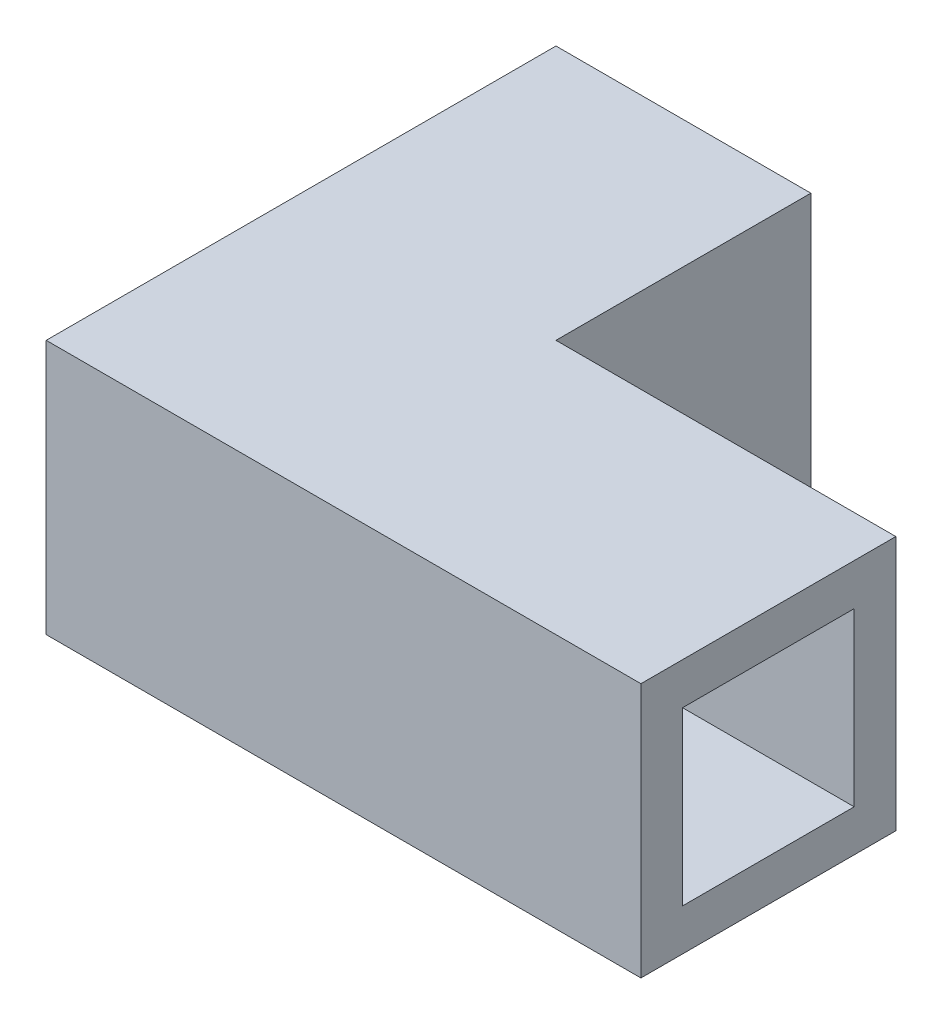
ISO-10303-21;
HEADER;
FILE_DESCRIPTION(('STEP AP214'),'2;1');
FILE_NAME('part.step','',(''),(''),'','','');
FILE_SCHEMA(('AUTOMOTIVE_DESIGN { 1 0 10303 214 1 1 1 1 }'));
ENDSEC;
DATA;
#1=APPLICATION_CONTEXT('core data for automotive mechanical design processes');
#2=APPLICATION_PROTOCOL_DEFINITION('international standard','automotive_design',2000,#1);
#3=PRODUCT_CONTEXT('',#1,'mechanical');
#4=PRODUCT('Part','Part','',(#3));
#5=PRODUCT_RELATED_PRODUCT_CATEGORY('part','',(#4));
#6=PRODUCT_DEFINITION_FORMATION('','',#4);
#7=PRODUCT_DEFINITION_CONTEXT('part definition',#1,'design');
#8=PRODUCT_DEFINITION('design','',#6,#7);
#9=PRODUCT_DEFINITION_SHAPE('','',#8);
#10=(LENGTH_UNIT() NAMED_UNIT(*) SI_UNIT(.MILLI.,.METRE.));
#11=(NAMED_UNIT(*) PLANE_ANGLE_UNIT() SI_UNIT($,.RADIAN.));
#12=(NAMED_UNIT(*) SI_UNIT($,.STERADIAN.) SOLID_ANGLE_UNIT());
#13=UNCERTAINTY_MEASURE_WITH_UNIT(LENGTH_MEASURE(1.E-05),#10,'distance_accuracy_value','');
#14=(GEOMETRIC_REPRESENTATION_CONTEXT(3) GLOBAL_UNCERTAINTY_ASSIGNED_CONTEXT((#13)) GLOBAL_UNIT_ASSIGNED_CONTEXT((#10,
#11,#12)) REPRESENTATION_CONTEXT('',''));
#15=CARTESIAN_POINT('',(0.,0.,0.));
#16=DIRECTION('',(0.,0.,1.));
#17=DIRECTION('',(1.,0.,0.));
#18=AXIS2_PLACEMENT_3D('',#15,#16,#17);
#19=CARTESIAN_POINT('',(0.,15.,-30.));
#20=DIRECTION('',(0.,0.,1.));
#21=DIRECTION('',(1.,0.,0.));
#22=AXIS2_PLACEMENT_3D('',#19,#20,#21);
#23=PLANE('',#22);
#24=DIRECTION('',(1.,0.,0.));
#25=VECTOR('',#24,1.);
#26=CARTESIAN_POINT('',(-2.44999999999999,12.55,-30.));
#27=LINE('',#26,#25);
#28=CARTESIAN_POINT('',(-12.55,12.55,-30.));
#29=VERTEX_POINT('',#28);
#30=CARTESIAN_POINT('',(-2.44999999999999,12.55,-30.));
#31=VERTEX_POINT('',#30);
#32=EDGE_CURVE('E224',#29,#31,#27,.T.);
#33=ORIENTED_EDGE('',*,*,#32,.F.);
#34=DIRECTION('',(0.,1.,0.));
#35=VECTOR('',#34,1.);
#36=CARTESIAN_POINT('',(-12.55,12.55,-30.));
#37=LINE('',#36,#35);
#38=CARTESIAN_POINT('',(-12.55,2.45,-30.));
#39=VERTEX_POINT('',#38);
#40=EDGE_CURVE('E207',#39,#29,#37,.T.);
#41=ORIENTED_EDGE('',*,*,#40,.F.);
#42=DIRECTION('',(-1.,0.,0.));
#43=VECTOR('',#42,1.);
#44=CARTESIAN_POINT('',(-2.44999999999999,2.45,-30.));
#45=LINE('',#44,#43);
#46=CARTESIAN_POINT('',(-2.44999999999999,2.45,-30.));
#47=VERTEX_POINT('',#46);
#48=EDGE_CURVE('E213',#47,#39,#45,.T.);
#49=ORIENTED_EDGE('',*,*,#48,.F.);
#50=DIRECTION('',(0.,-1.,0.));
#51=VECTOR('',#50,1.);
#52=CARTESIAN_POINT('',(-2.44999999999999,12.55,-30.));
#53=LINE('',#52,#51);
#54=EDGE_CURVE('E227',#31,#47,#53,.T.);
#55=ORIENTED_EDGE('',*,*,#54,.F.);
#56=EDGE_LOOP('',(#33,#41,#49,#55));
#57=FACE_BOUND('',#56,.T.);
#58=DIRECTION('',(-1.,0.,0.));
#59=VECTOR('',#58,1.);
#60=CARTESIAN_POINT('',(0.,0.,-30.));
#61=LINE('',#60,#59);
#62=CARTESIAN_POINT('',(0.,0.,-30.));
#63=VERTEX_POINT('',#62);
#64=CARTESIAN_POINT('',(-15.,0.,-30.));
#65=VERTEX_POINT('',#64);
#66=EDGE_CURVE('E266',#63,#65,#61,.T.);
#67=ORIENTED_EDGE('',*,*,#66,.T.);
#68=DIRECTION('',(0.,-1.,0.));
#69=VECTOR('',#68,1.);
#70=CARTESIAN_POINT('',(-15.,15.,-30.));
#71=LINE('',#70,#69);
#72=CARTESIAN_POINT('',(-15.,15.,-30.));
#73=VERTEX_POINT('',#72);
#74=EDGE_CURVE('E314',#73,#65,#71,.T.);
#75=ORIENTED_EDGE('',*,*,#74,.F.);
#76=DIRECTION('',(-1.,0.,0.));
#77=VECTOR('',#76,1.);
#78=CARTESIAN_POINT('',(0.,15.,-30.));
#79=LINE('',#78,#77);
#80=CARTESIAN_POINT('',(0.,15.,-30.));
#81=VERTEX_POINT('',#80);
#82=EDGE_CURVE('E273',#81,#73,#79,.T.);
#83=ORIENTED_EDGE('',*,*,#82,.F.);
#84=DIRECTION('',(0.,-1.,0.));
#85=VECTOR('',#84,1.);
#86=CARTESIAN_POINT('',(0.,15.,-30.));
#87=LINE('',#86,#85);
#88=EDGE_CURVE('E287',#81,#63,#87,.T.);
#89=ORIENTED_EDGE('',*,*,#88,.T.);
#90=EDGE_LOOP('',(#67,#75,#83,#89));
#91=FACE_BOUND('',#90,.T.);
#92=ADVANCED_FACE('F35',(#57,#91),#23,.F.);
#93=CARTESIAN_POINT('',(-15.,15.,-30.));
#94=DIRECTION('',(1.,0.,0.));
#95=DIRECTION('',(0.,0.,-1.));
#96=AXIS2_PLACEMENT_3D('',#93,#94,#95);
#97=PLANE('',#96);
#98=DIRECTION('',(0.,0.,1.));
#99=VECTOR('',#98,1.);
#100=CARTESIAN_POINT('',(-15.,0.,-30.));
#101=LINE('',#100,#99);
#102=CARTESIAN_POINT('',(-15.,0.,0.));
#103=VERTEX_POINT('',#102);
#104=EDGE_CURVE('E290',#65,#103,#101,.T.);
#105=ORIENTED_EDGE('',*,*,#104,.T.);
#106=DIRECTION('',(0.,-1.,0.));
#107=VECTOR('',#106,1.);
#108=CARTESIAN_POINT('',(-15.,15.,0.));
#109=LINE('',#108,#107);
#110=CARTESIAN_POINT('',(-15.,15.,0.));
#111=VERTEX_POINT('',#110);
#112=EDGE_CURVE('E311',#111,#103,#109,.T.);
#113=ORIENTED_EDGE('',*,*,#112,.F.);
#114=DIRECTION('',(0.,0.,1.));
#115=VECTOR('',#114,1.);
#116=CARTESIAN_POINT('',(-15.,15.,-30.));
#117=LINE('',#116,#115);
#118=EDGE_CURVE('E276',#73,#111,#117,.T.);
#119=ORIENTED_EDGE('',*,*,#118,.F.);
#120=ORIENTED_EDGE('',*,*,#74,.T.);
#121=EDGE_LOOP('',(#105,#113,#119,#120));
#122=FACE_BOUND('',#121,.T.);
#123=ADVANCED_FACE('F347',(#122),#97,.F.);
#124=CARTESIAN_POINT('',(0.,15.,0.));
#125=DIRECTION('',(0.,0.,-1.));
#126=DIRECTION('',(-1.,0.,0.));
#127=AXIS2_PLACEMENT_3D('',#124,#125,#126);
#128=PLANE('',#127);
#129=DIRECTION('',(1.,0.,0.));
#130=VECTOR('',#129,1.);
#131=CARTESIAN_POINT('',(0.,0.,0.));
#132=LINE('',#131,#130);
#133=CARTESIAN_POINT('',(20.,0.,0.));
#134=VERTEX_POINT('',#133);
#135=EDGE_CURVE('E293',#103,#134,#132,.T.);
#136=ORIENTED_EDGE('',*,*,#135,.T.);
#137=DIRECTION('',(0.,-1.,0.));
#138=VECTOR('',#137,1.);
#139=CARTESIAN_POINT('',(20.,15.,0.));
#140=LINE('',#139,#138);
#141=CARTESIAN_POINT('',(20.,15.,0.));
#142=VERTEX_POINT('',#141);
#143=EDGE_CURVE('E308',#142,#134,#140,.T.);
#144=ORIENTED_EDGE('',*,*,#143,.F.);
#145=DIRECTION('',(1.,0.,0.));
#146=VECTOR('',#145,1.);
#147=CARTESIAN_POINT('',(-15.,15.,0.));
#148=LINE('',#147,#146);
#149=EDGE_CURVE('E279',#111,#142,#148,.T.);
#150=ORIENTED_EDGE('',*,*,#149,.F.);
#151=ORIENTED_EDGE('',*,*,#112,.T.);
#152=EDGE_LOOP('',(#136,#144,#150,#151));
#153=FACE_BOUND('',#152,.T.);
#154=ADVANCED_FACE('F353',(#153),#128,.F.);
#155=CARTESIAN_POINT('',(20.,15.,0.));
#156=DIRECTION('',(-1.,0.,0.));
#157=DIRECTION('',(0.,0.,1.));
#158=AXIS2_PLACEMENT_3D('',#155,#156,#157);
#159=PLANE('',#158);
#160=DIRECTION('',(0.,0.,1.));
#161=VECTOR('',#160,1.);
#162=CARTESIAN_POINT('',(20.,12.55,-2.44999999999999));
#163=LINE('',#162,#161);
#164=CARTESIAN_POINT('',(20.,12.55,-12.55));
#165=VERTEX_POINT('',#164);
#166=CARTESIAN_POINT('',(20.,12.55,-2.44999999999999));
#167=VERTEX_POINT('',#166);
#168=EDGE_CURVE('E256',#165,#167,#163,.T.);
#169=ORIENTED_EDGE('',*,*,#168,.F.);
#170=DIRECTION('',(0.,1.,0.));
#171=VECTOR('',#170,1.);
#172=CARTESIAN_POINT('',(20.,2.45,-12.55));
#173=LINE('',#172,#171);
#174=CARTESIAN_POINT('',(20.,2.45,-12.55));
#175=VERTEX_POINT('',#174);
#176=EDGE_CURVE('E234',#175,#165,#173,.T.);
#177=ORIENTED_EDGE('',*,*,#176,.F.);
#178=DIRECTION('',(0.,0.,-1.));
#179=VECTOR('',#178,1.);
#180=CARTESIAN_POINT('',(20.,2.45,-2.44999999999999));
#181=LINE('',#180,#179);
#182=CARTESIAN_POINT('',(20.,2.45,-2.44999999999999));
#183=VERTEX_POINT('',#182);
#184=EDGE_CURVE('E245',#183,#175,#181,.T.);
#185=ORIENTED_EDGE('',*,*,#184,.F.);
#186=DIRECTION('',(0.,-1.,0.));
#187=VECTOR('',#186,1.);
#188=CARTESIAN_POINT('',(20.,2.45,-2.44999999999999));
#189=LINE('',#188,#187);
#190=EDGE_CURVE('E259',#167,#183,#189,.T.);
#191=ORIENTED_EDGE('',*,*,#190,.F.);
#192=EDGE_LOOP('',(#169,#177,#185,#191));
#193=FACE_BOUND('',#192,.T.);
#194=DIRECTION('',(0.,0.,-1.));
#195=VECTOR('',#194,1.);
#196=CARTESIAN_POINT('',(20.,0.,0.));
#197=LINE('',#196,#195);
#198=CARTESIAN_POINT('',(20.,0.,-15.));
#199=VERTEX_POINT('',#198);
#200=EDGE_CURVE('E295',#134,#199,#197,.T.);
#201=ORIENTED_EDGE('',*,*,#200,.T.);
#202=DIRECTION('',(0.,-1.,0.));
#203=VECTOR('',#202,1.);
#204=CARTESIAN_POINT('',(20.,15.,-15.));
#205=LINE('',#204,#203);
#206=CARTESIAN_POINT('',(20.,15.,-15.));
#207=VERTEX_POINT('',#206);
#208=EDGE_CURVE('E305',#207,#199,#205,.T.);
#209=ORIENTED_EDGE('',*,*,#208,.F.);
#210=DIRECTION('',(0.,0.,-1.));
#211=VECTOR('',#210,1.);
#212=CARTESIAN_POINT('',(20.,15.,0.));
#213=LINE('',#212,#211);
#214=EDGE_CURVE('E281',#142,#207,#213,.T.);
#215=ORIENTED_EDGE('',*,*,#214,.F.);
#216=ORIENTED_EDGE('',*,*,#143,.T.);
#217=EDGE_LOOP('',(#201,#209,#215,#216));
#218=FACE_BOUND('',#217,.T.);
#219=ADVANCED_FACE('F361',(#193,#218),#159,.F.);
#220=CARTESIAN_POINT('',(20.,15.,-15.));
#221=DIRECTION('',(0.,0.,1.));
#222=DIRECTION('',(1.,0.,0.));
#223=AXIS2_PLACEMENT_3D('',#220,#221,#222);
#224=PLANE('',#223);
#225=DIRECTION('',(-1.,0.,0.));
#226=VECTOR('',#225,1.);
#227=CARTESIAN_POINT('',(20.,0.,-15.));
#228=LINE('',#227,#226);
#229=CARTESIAN_POINT('',(0.,0.,-15.));
#230=VERTEX_POINT('',#229);
#231=EDGE_CURVE('E297',#199,#230,#228,.T.);
#232=ORIENTED_EDGE('',*,*,#231,.T.);
#233=DIRECTION('',(0.,-1.,0.));
#234=VECTOR('',#233,1.);
#235=CARTESIAN_POINT('',(0.,15.,-15.));
#236=LINE('',#235,#234);
#237=CARTESIAN_POINT('',(0.,15.,-15.));
#238=VERTEX_POINT('',#237);
#239=EDGE_CURVE('E302',#238,#230,#236,.T.);
#240=ORIENTED_EDGE('',*,*,#239,.F.);
#241=DIRECTION('',(-1.,0.,0.));
#242=VECTOR('',#241,1.);
#243=CARTESIAN_POINT('',(20.,15.,-15.));
#244=LINE('',#243,#242);
#245=EDGE_CURVE('E283',#207,#238,#244,.T.);
#246=ORIENTED_EDGE('',*,*,#245,.F.);
#247=ORIENTED_EDGE('',*,*,#208,.T.);
#248=EDGE_LOOP('',(#232,#240,#246,#247));
#249=FACE_BOUND('',#248,.T.);
#250=ADVANCED_FACE('F365',(#249),#224,.F.);
#251=CARTESIAN_POINT('',(0.,15.,-15.));
#252=DIRECTION('',(-1.,0.,0.));
#253=DIRECTION('',(0.,0.,1.));
#254=AXIS2_PLACEMENT_3D('',#251,#252,#253);
#255=PLANE('',#254);
#256=DIRECTION('',(0.,0.,-1.));
#257=VECTOR('',#256,1.);
#258=CARTESIAN_POINT('',(0.,0.,-15.));
#259=LINE('',#258,#257);
#260=EDGE_CURVE('E277',#230,#63,#259,.T.);
#261=ORIENTED_EDGE('',*,*,#260,.T.);
#262=ORIENTED_EDGE('',*,*,#88,.F.);
#263=DIRECTION('',(0.,0.,-1.));
#264=VECTOR('',#263,1.);
#265=CARTESIAN_POINT('',(0.,15.,-15.));
#266=LINE('',#265,#264);
#267=EDGE_CURVE('E285',#238,#81,#266,.T.);
#268=ORIENTED_EDGE('',*,*,#267,.F.);
#269=ORIENTED_EDGE('',*,*,#239,.T.);
#270=EDGE_LOOP('',(#261,#262,#268,#269));
#271=FACE_BOUND('',#270,.T.);
#272=ADVANCED_FACE('F369',(#271),#255,.F.);
#273=CARTESIAN_POINT('',(0.,15.,0.));
#274=DIRECTION('',(0.,1.,0.));
#275=DIRECTION('',(0.,0.,1.));
#276=AXIS2_PLACEMENT_3D('',#273,#274,#275);
#277=PLANE('',#276);
#278=ORIENTED_EDGE('',*,*,#82,.T.);
#279=ORIENTED_EDGE('',*,*,#118,.T.);
#280=ORIENTED_EDGE('',*,*,#149,.T.);
#281=ORIENTED_EDGE('',*,*,#214,.T.);
#282=ORIENTED_EDGE('',*,*,#245,.T.);
#283=ORIENTED_EDGE('',*,*,#267,.T.);
#284=EDGE_LOOP('',(#278,#279,#280,#281,#282,#283));
#285=FACE_BOUND('',#284,.T.);
#286=ADVANCED_FACE('F373',(#285),#277,.T.);
#287=CARTESIAN_POINT('',(0.,0.,0.));
#288=DIRECTION('',(0.,1.,0.));
#289=DIRECTION('',(0.,0.,1.));
#290=AXIS2_PLACEMENT_3D('',#287,#288,#289);
#291=PLANE('',#290);
#292=ORIENTED_EDGE('',*,*,#66,.F.);
#293=ORIENTED_EDGE('',*,*,#260,.F.);
#294=ORIENTED_EDGE('',*,*,#231,.F.);
#295=ORIENTED_EDGE('',*,*,#200,.F.);
#296=ORIENTED_EDGE('',*,*,#135,.F.);
#297=ORIENTED_EDGE('',*,*,#104,.F.);
#298=EDGE_LOOP('',(#292,#293,#294,#295,#296,#297));
#299=FACE_BOUND('',#298,.T.);
#300=ADVANCED_FACE('F375',(#299),#291,.F.);
#301=CARTESIAN_POINT('',(0.,2.45,-12.55));
#302=DIRECTION('',(0.,0.,-1.));
#303=DIRECTION('',(-1.,0.,0.));
#304=AXIS2_PLACEMENT_3D('',#301,#302,#303);
#305=PLANE('',#304);
#306=ORIENTED_EDGE('',*,*,#176,.T.);
#307=DIRECTION('',(1.,0.,0.));
#308=VECTOR('',#307,1.);
#309=CARTESIAN_POINT('',(0.,12.55,-12.55));
#310=LINE('',#309,#308);
#311=CARTESIAN_POINT('',(0.,12.55,-12.55));
#312=VERTEX_POINT('',#311);
#313=EDGE_CURVE('E254',#312,#165,#310,.T.);
#314=ORIENTED_EDGE('',*,*,#313,.F.);
#315=DIRECTION('',(0.,1.,0.));
#316=VECTOR('',#315,1.);
#317=CARTESIAN_POINT('',(0.,2.45,-12.55));
#318=LINE('',#317,#316);
#319=CARTESIAN_POINT('',(0.,2.45,-12.55));
#320=VERTEX_POINT('',#319);
#321=EDGE_CURVE('E241',#320,#312,#318,.T.);
#322=ORIENTED_EDGE('',*,*,#321,.F.);
#323=DIRECTION('',(1.,0.,0.));
#324=VECTOR('',#323,1.);
#325=CARTESIAN_POINT('',(0.,2.45,-12.55));
#326=LINE('',#325,#324);
#327=EDGE_CURVE('E264',#320,#175,#326,.T.);
#328=ORIENTED_EDGE('',*,*,#327,.T.);
#329=EDGE_LOOP('',(#306,#314,#322,#328));
#330=FACE_BOUND('',#329,.T.);
#331=ADVANCED_FACE('F378',(#330),#305,.F.);
#332=CARTESIAN_POINT('',(0.,2.45,-2.45));
#333=DIRECTION('',(0.,-1.,0.));
#334=DIRECTION('',(0.,0.,-1.));
#335=AXIS2_PLACEMENT_3D('',#332,#333,#334);
#336=PLANE('',#335);
#337=ORIENTED_EDGE('',*,*,#184,.T.);
#338=ORIENTED_EDGE('',*,*,#327,.F.);
#339=DIRECTION('',(0.,0.,-1.));
#340=VECTOR('',#339,1.);
#341=CARTESIAN_POINT('',(0.,2.45,-2.45));
#342=LINE('',#341,#340);
#343=CARTESIAN_POINT('',(0.,2.45,-2.45));
#344=VERTEX_POINT('',#343);
#345=EDGE_CURVE('E251',#344,#320,#342,.T.);
#346=ORIENTED_EDGE('',*,*,#345,.F.);
#347=DIRECTION('',(1.,0.,0.));
#348=VECTOR('',#347,1.);
#349=CARTESIAN_POINT('',(0.,2.45,-2.45));
#350=LINE('',#349,#348);
#351=EDGE_CURVE('E267',#344,#183,#350,.T.);
#352=ORIENTED_EDGE('',*,*,#351,.T.);
#353=EDGE_LOOP('',(#337,#338,#346,#352));
#354=FACE_BOUND('',#353,.T.);
#355=ADVANCED_FACE('F385',(#354),#336,.F.);
#356=CARTESIAN_POINT('',(0.,2.45,-2.45));
#357=DIRECTION('',(0.,0.,1.));
#358=DIRECTION('',(1.,0.,0.));
#359=AXIS2_PLACEMENT_3D('',#356,#357,#358);
#360=PLANE('',#359);
#361=ORIENTED_EDGE('',*,*,#190,.T.);
#362=ORIENTED_EDGE('',*,*,#351,.F.);
#363=DIRECTION('',(0.,-1.,0.));
#364=VECTOR('',#363,1.);
#365=CARTESIAN_POINT('',(0.,2.45,-2.45));
#366=LINE('',#365,#364);
#367=CARTESIAN_POINT('',(0.,12.55,-2.45));
#368=VERTEX_POINT('',#367);
#369=EDGE_CURVE('E248',#368,#344,#366,.T.);
#370=ORIENTED_EDGE('',*,*,#369,.F.);
#371=DIRECTION('',(1.,0.,0.));
#372=VECTOR('',#371,1.);
#373=CARTESIAN_POINT('',(0.,12.55,-2.45));
#374=LINE('',#373,#372);
#375=EDGE_CURVE('E269',#368,#167,#374,.T.);
#376=ORIENTED_EDGE('',*,*,#375,.T.);
#377=EDGE_LOOP('',(#361,#362,#370,#376));
#378=FACE_BOUND('',#377,.T.);
#379=ADVANCED_FACE('F390',(#378),#360,.F.);
#380=CARTESIAN_POINT('',(0.,12.55,-2.45));
#381=DIRECTION('',(0.,1.,0.));
#382=DIRECTION('',(0.,0.,1.));
#383=AXIS2_PLACEMENT_3D('',#380,#381,#382);
#384=PLANE('',#383);
#385=ORIENTED_EDGE('',*,*,#168,.T.);
#386=ORIENTED_EDGE('',*,*,#375,.F.);
#387=DIRECTION('',(0.,0.,1.));
#388=VECTOR('',#387,1.);
#389=CARTESIAN_POINT('',(0.,12.55,-2.45));
#390=LINE('',#389,#388);
#391=EDGE_CURVE('E244',#312,#368,#390,.T.);
#392=ORIENTED_EDGE('',*,*,#391,.F.);
#393=ORIENTED_EDGE('',*,*,#313,.T.);
#394=EDGE_LOOP('',(#385,#386,#392,#393));
#395=FACE_BOUND('',#394,.T.);
#396=ADVANCED_FACE('F387',(#395),#384,.F.);
#397=CARTESIAN_POINT('',(0.,0.,0.));
#398=DIRECTION('',(-1.,0.,0.));
#399=DIRECTION('',(0.,0.,1.));
#400=AXIS2_PLACEMENT_3D('',#397,#398,#399);
#401=PLANE('',#400);
#402=DIRECTION('',(0.,0.,1.));
#403=VECTOR('',#402,1.);
#404=CARTESIAN_POINT('',(0.,11.5,-11.5));
#405=LINE('',#404,#403);
#406=CARTESIAN_POINT('',(0.,11.5,-11.5005000750175));
#407=VERTEX_POINT('',#406);
#408=CARTESIAN_POINT('',(0.,11.5,-3.5));
#409=VERTEX_POINT('',#408);
#410=EDGE_CURVE('E188',#407,#409,#405,.T.);
#411=ORIENTED_EDGE('',*,*,#410,.F.);
#412=DIRECTION('',(0.,1.,0.));
#413=VECTOR('',#412,1.);
#414=CARTESIAN_POINT('',(0.,7.5,-11.5005000750175));
#415=LINE('',#414,#413);
#416=CARTESIAN_POINT('',(0.,3.5,-11.5005000750175));
#417=VERTEX_POINT('',#416);
#418=EDGE_CURVE('E186',#407,#417,#415,.F.);
#419=ORIENTED_EDGE('',*,*,#418,.T.);
#420=DIRECTION('',(0.,0.,-1.));
#421=VECTOR('',#420,1.);
#422=CARTESIAN_POINT('',(0.,3.5,-11.5));
#423=LINE('',#422,#421);
#424=CARTESIAN_POINT('',(0.,3.5,-3.5));
#425=VERTEX_POINT('',#424);
#426=EDGE_CURVE('E172',#425,#417,#423,.T.);
#427=ORIENTED_EDGE('',*,*,#426,.F.);
#428=DIRECTION('',(0.,-1.,0.));
#429=VECTOR('',#428,1.);
#430=CARTESIAN_POINT('',(0.,11.5,-3.5));
#431=LINE('',#430,#429);
#432=EDGE_CURVE('E178',#409,#425,#431,.T.);
#433=ORIENTED_EDGE('',*,*,#432,.F.);
#434=EDGE_LOOP('',(#411,#419,#427,#433));
#435=FACE_BOUND('',#434,.T.);
#436=ORIENTED_EDGE('',*,*,#321,.T.);
#437=ORIENTED_EDGE('',*,*,#391,.T.);
#438=ORIENTED_EDGE('',*,*,#369,.T.);
#439=ORIENTED_EDGE('',*,*,#345,.T.);
#440=EDGE_LOOP('',(#436,#437,#438,#439));
#441=FACE_BOUND('',#440,.T.);
#442=ADVANCED_FACE('F183',(#435,#441),#401,.F.);
#443=CARTESIAN_POINT('',(-12.55,12.55,-13.));
#444=DIRECTION('',(-1.,0.,0.));
#445=DIRECTION('',(0.,0.,1.));
#446=AXIS2_PLACEMENT_3D('',#443,#444,#445);
#447=PLANE('',#446);
#448=ORIENTED_EDGE('',*,*,#40,.T.);
#449=DIRECTION('',(0.,0.,-1.));
#450=VECTOR('',#449,1.);
#451=CARTESIAN_POINT('',(-12.55,12.55,-13.));
#452=LINE('',#451,#450);
#453=CARTESIAN_POINT('',(-12.55,12.55,-13.));
#454=VERTEX_POINT('',#453);
#455=EDGE_CURVE('E222',#454,#29,#452,.T.);
#456=ORIENTED_EDGE('',*,*,#455,.F.);
#457=DIRECTION('',(0.,1.,0.));
#458=VECTOR('',#457,1.);
#459=CARTESIAN_POINT('',(-12.55,12.55,-13.));
#460=LINE('',#459,#458);
#461=CARTESIAN_POINT('',(-12.55,2.45,-13.));
#462=VERTEX_POINT('',#461);
#463=EDGE_CURVE('E209',#462,#454,#460,.T.);
#464=ORIENTED_EDGE('',*,*,#463,.F.);
#465=DIRECTION('',(0.,0.,-1.));
#466=VECTOR('',#465,1.);
#467=CARTESIAN_POINT('',(-12.55,2.45,-13.));
#468=LINE('',#467,#466);
#469=EDGE_CURVE('E232',#462,#39,#468,.T.);
#470=ORIENTED_EDGE('',*,*,#469,.T.);
#471=EDGE_LOOP('',(#448,#456,#464,#470));
#472=FACE_BOUND('',#471,.T.);
#473=ADVANCED_FACE('F400',(#472),#447,.F.);
#474=CARTESIAN_POINT('',(-2.45,2.45,-13.));
#475=DIRECTION('',(0.,-1.,0.));
#476=DIRECTION('',(0.,0.,-1.));
#477=AXIS2_PLACEMENT_3D('',#474,#475,#476);
#478=PLANE('',#477);
#479=ORIENTED_EDGE('',*,*,#48,.T.);
#480=ORIENTED_EDGE('',*,*,#469,.F.);
#481=DIRECTION('',(-1.,0.,0.));
#482=VECTOR('',#481,1.);
#483=CARTESIAN_POINT('',(-2.45,2.45,-13.));
#484=LINE('',#483,#482);
#485=CARTESIAN_POINT('',(-2.45,2.45,-13.));
#486=VERTEX_POINT('',#485);
#487=EDGE_CURVE('E219',#486,#462,#484,.T.);
#488=ORIENTED_EDGE('',*,*,#487,.F.);
#489=DIRECTION('',(0.,0.,-1.));
#490=VECTOR('',#489,1.);
#491=CARTESIAN_POINT('',(-2.45,2.45,-13.));
#492=LINE('',#491,#490);
#493=EDGE_CURVE('E235',#486,#47,#492,.T.);
#494=ORIENTED_EDGE('',*,*,#493,.T.);
#495=EDGE_LOOP('',(#479,#480,#488,#494));
#496=FACE_BOUND('',#495,.T.);
#497=ADVANCED_FACE('F403',(#496),#478,.F.);
#498=CARTESIAN_POINT('',(-2.45,12.55,-13.));
#499=DIRECTION('',(1.,0.,0.));
#500=DIRECTION('',(0.,0.,-1.));
#501=AXIS2_PLACEMENT_3D('',#498,#499,#500);
#502=PLANE('',#501);
#503=ORIENTED_EDGE('',*,*,#54,.T.);
#504=ORIENTED_EDGE('',*,*,#493,.F.);
#505=DIRECTION('',(0.,-1.,0.));
#506=VECTOR('',#505,1.);
#507=CARTESIAN_POINT('',(-2.45,12.55,-13.));
#508=LINE('',#507,#506);
#509=CARTESIAN_POINT('',(-2.45,12.55,-13.));
#510=VERTEX_POINT('',#509);
#511=EDGE_CURVE('E216',#510,#486,#508,.T.);
#512=ORIENTED_EDGE('',*,*,#511,.F.);
#513=DIRECTION('',(0.,0.,-1.));
#514=VECTOR('',#513,1.);
#515=CARTESIAN_POINT('',(-2.45,12.55,-13.));
#516=LINE('',#515,#514);
#517=EDGE_CURVE('E237',#510,#31,#516,.T.);
#518=ORIENTED_EDGE('',*,*,#517,.T.);
#519=EDGE_LOOP('',(#503,#504,#512,#518));
#520=FACE_BOUND('',#519,.T.);
#521=ADVANCED_FACE('F408',(#520),#502,.F.);
#522=CARTESIAN_POINT('',(-2.45,12.55,-13.));
#523=DIRECTION('',(0.,1.,0.));
#524=DIRECTION('',(0.,0.,1.));
#525=AXIS2_PLACEMENT_3D('',#522,#523,#524);
#526=PLANE('',#525);
#527=ORIENTED_EDGE('',*,*,#32,.T.);
#528=ORIENTED_EDGE('',*,*,#517,.F.);
#529=DIRECTION('',(1.,0.,0.));
#530=VECTOR('',#529,1.);
#531=CARTESIAN_POINT('',(-2.45,12.55,-13.));
#532=LINE('',#531,#530);
#533=EDGE_CURVE('E212',#454,#510,#532,.T.);
#534=ORIENTED_EDGE('',*,*,#533,.F.);
#535=ORIENTED_EDGE('',*,*,#455,.T.);
#536=EDGE_LOOP('',(#527,#528,#534,#535));
#537=FACE_BOUND('',#536,.T.);
#538=ADVANCED_FACE('F405',(#537),#526,.F.);
#539=CARTESIAN_POINT('',(0.,0.,-13.));
#540=DIRECTION('',(0.,0.,-1.));
#541=DIRECTION('',(-1.,0.,0.));
#542=AXIS2_PLACEMENT_3D('',#539,#540,#541);
#543=PLANE('',#542);
#544=DIRECTION('',(0.,-1.,0.));
#545=VECTOR('',#544,1.);
#546=CARTESIAN_POINT('',(-3.5,11.5,-13.));
#547=LINE('',#546,#545);
#548=CARTESIAN_POINT('',(-3.5,11.5,-13.));
#549=VERTEX_POINT('',#548);
#550=CARTESIAN_POINT('',(-3.5,3.5,-13.));
#551=VERTEX_POINT('',#550);
#552=EDGE_CURVE('E174',#549,#551,#547,.T.);
#553=ORIENTED_EDGE('',*,*,#552,.F.);
#554=DIRECTION('',(1.,0.,0.));
#555=VECTOR('',#554,1.);
#556=CARTESIAN_POINT('',(-11.5,11.5,-13.));
#557=LINE('',#556,#555);
#558=CARTESIAN_POINT('',(-11.5,11.5,-13.));
#559=VERTEX_POINT('',#558);
#560=EDGE_CURVE('E201',#559,#549,#557,.T.);
#561=ORIENTED_EDGE('',*,*,#560,.F.);
#562=DIRECTION('',(0.,1.,0.));
#563=VECTOR('',#562,1.);
#564=CARTESIAN_POINT('',(-11.5,11.5,-13.));
#565=LINE('',#564,#563);
#566=CARTESIAN_POINT('',(-11.5,3.5,-13.));
#567=VERTEX_POINT('',#566);
#568=EDGE_CURVE('E198',#567,#559,#565,.T.);
#569=ORIENTED_EDGE('',*,*,#568,.F.);
#570=DIRECTION('',(-1.,0.,0.));
#571=VECTOR('',#570,1.);
#572=CARTESIAN_POINT('',(-11.5,3.5,-13.));
#573=LINE('',#572,#571);
#574=EDGE_CURVE('E195',#551,#567,#573,.T.);
#575=ORIENTED_EDGE('',*,*,#574,.F.);
#576=EDGE_LOOP('',(#553,#561,#569,#575));
#577=FACE_BOUND('',#576,.T.);
#578=ORIENTED_EDGE('',*,*,#463,.T.);
#579=ORIENTED_EDGE('',*,*,#533,.T.);
#580=ORIENTED_EDGE('',*,*,#511,.T.);
#581=ORIENTED_EDGE('',*,*,#487,.T.);
#582=EDGE_LOOP('',(#578,#579,#580,#581));
#583=FACE_BOUND('',#582,.T.);
#584=ADVANCED_FACE('F334',(#577,#583),#543,.T.);
#585=CARTESIAN_POINT('',(-11.5,11.5,-9.));
#586=DIRECTION('',(0.,1.,0.));
#587=DIRECTION('',(0.,0.,1.));
#588=AXIS2_PLACEMENT_3D('',#585,#586,#587);
#589=PLANE('',#588);
#590=DIRECTION('',(1.,0.,0.));
#591=VECTOR('',#590,1.);
#592=CARTESIAN_POINT('',(-22.8137084989848,11.5,-3.50000000000002));
#593=LINE('',#592,#591);
#594=CARTESIAN_POINT('',(-6.5,11.5,-3.5));
#595=VERTEX_POINT('',#594);
#596=EDGE_CURVE('E175',#595,#409,#593,.T.);
#597=ORIENTED_EDGE('',*,*,#596,.F.);
#598=CARTESIAN_POINT('',(-6.5,11.5,-8.5));
#599=DIRECTION('',(0.,1.,0.));
#600=DIRECTION('',(0.,0.,1.));
#601=AXIS2_PLACEMENT_3D('',#598,#599,#600);
#602=CIRCLE('',#601,5.);
#603=CARTESIAN_POINT('',(-11.5,11.5,-8.50000000000001));
#604=VERTEX_POINT('',#603);
#605=EDGE_CURVE('E323',#595,#604,#602,.F.);
#606=ORIENTED_EDGE('',*,*,#605,.T.);
#607=DIRECTION('',(0.,0.,-1.));
#608=VECTOR('',#607,1.);
#609=CARTESIAN_POINT('',(-11.5,11.5,-9.));
#610=LINE('',#609,#608);
#611=EDGE_CURVE('E205',#604,#559,#610,.T.);
#612=ORIENTED_EDGE('',*,*,#611,.T.);
#613=ORIENTED_EDGE('',*,*,#560,.T.);
#614=CARTESIAN_POINT('',(0.0707142142714248,11.5,-16.5));
#615=DIRECTION('',(0.,1.,0.));
#616=DIRECTION('',(0.,0.,1.));
#617=AXIS2_PLACEMENT_3D('',#614,#615,#616);
#618=CIRCLE('',#617,5.);
#619=EDGE_CURVE('E43',#549,#407,#618,.T.);
#620=ORIENTED_EDGE('',*,*,#619,.T.);
#621=ORIENTED_EDGE('',*,*,#410,.T.);
#622=EDGE_LOOP('',(#597,#606,#612,#613,#620,#621));
#623=FACE_BOUND('',#622,.T.);
#624=ADVANCED_FACE('F326',(#623),#589,.F.);
#625=CARTESIAN_POINT('',(-11.5,11.5,-9.));
#626=DIRECTION('',(-1.,0.,0.));
#627=DIRECTION('',(0.,0.,1.));
#628=AXIS2_PLACEMENT_3D('',#625,#626,#627);
#629=PLANE('',#628);
#630=ORIENTED_EDGE('',*,*,#611,.F.);
#631=DIRECTION('',(0.,-1.,0.));
#632=VECTOR('',#631,1.);
#633=CARTESIAN_POINT('',(-11.5,3.5,-8.50000000000001));
#634=LINE('',#633,#632);
#635=CARTESIAN_POINT('',(-11.5,3.5,-8.50000000000001));
#636=VERTEX_POINT('',#635);
#637=EDGE_CURVE('E318',#604,#636,#634,.T.);
#638=ORIENTED_EDGE('',*,*,#637,.T.);
#639=DIRECTION('',(0.,0.,-1.));
#640=VECTOR('',#639,1.);
#641=CARTESIAN_POINT('',(-11.5,3.5,-9.));
#642=LINE('',#641,#640);
#643=EDGE_CURVE('E204',#636,#567,#642,.T.);
#644=ORIENTED_EDGE('',*,*,#643,.T.);
#645=ORIENTED_EDGE('',*,*,#568,.T.);
#646=EDGE_LOOP('',(#630,#638,#644,#645));
#647=FACE_BOUND('',#646,.T.);
#648=ADVANCED_FACE('F338',(#647),#629,.F.);
#649=CARTESIAN_POINT('',(-11.5,3.5,-9.));
#650=DIRECTION('',(0.,-1.,0.));
#651=DIRECTION('',(0.,0.,-1.));
#652=AXIS2_PLACEMENT_3D('',#649,#650,#651);
#653=PLANE('',#652);
#654=ORIENTED_EDGE('',*,*,#643,.F.);
#655=CARTESIAN_POINT('',(-6.5,3.5,-8.5));
#656=DIRECTION('',(0.,-1.,0.));
#657=DIRECTION('',(0.,0.,-1.));
#658=AXIS2_PLACEMENT_3D('',#655,#656,#657);
#659=CIRCLE('',#658,5.);
#660=CARTESIAN_POINT('',(-6.5,3.5,-3.5));
#661=VERTEX_POINT('',#660);
#662=EDGE_CURVE('E58',#636,#661,#659,.F.);
#663=ORIENTED_EDGE('',*,*,#662,.T.);
#664=DIRECTION('',(1.,0.,0.));
#665=VECTOR('',#664,1.);
#666=CARTESIAN_POINT('',(-22.8137084989848,3.5,-3.50000000000002));
#667=LINE('',#666,#665);
#668=EDGE_CURVE('E168',#661,#425,#667,.T.);
#669=ORIENTED_EDGE('',*,*,#668,.T.);
#670=ORIENTED_EDGE('',*,*,#426,.T.);
#671=CARTESIAN_POINT('',(0.0707142142714248,3.5,-16.5));
#672=DIRECTION('',(0.,-1.,0.));
#673=DIRECTION('',(0.,0.,-1.));
#674=AXIS2_PLACEMENT_3D('',#671,#672,#673);
#675=CIRCLE('',#674,5.);
#676=EDGE_CURVE('E11',#417,#551,#675,.T.);
#677=ORIENTED_EDGE('',*,*,#676,.T.);
#678=ORIENTED_EDGE('',*,*,#574,.T.);
#679=EDGE_LOOP('',(#654,#663,#669,#670,#677,#678));
#680=FACE_BOUND('',#679,.T.);
#681=ADVANCED_FACE('F170',(#680),#653,.F.);
#682=CARTESIAN_POINT('',(-22.8137084989848,11.5,-3.50000000000002));
#683=DIRECTION('',(0.,0.,1.));
#684=DIRECTION('',(1.,0.,0.));
#685=AXIS2_PLACEMENT_3D('',#682,#683,#684);
#686=PLANE('',#685);
#687=ORIENTED_EDGE('',*,*,#668,.F.);
#688=DIRECTION('',(0.,-1.,0.));
#689=VECTOR('',#688,1.);
#690=CARTESIAN_POINT('',(-6.5,11.5,-3.5));
#691=LINE('',#690,#689);
#692=EDGE_CURVE('E50',#661,#595,#691,.F.);
#693=ORIENTED_EDGE('',*,*,#692,.T.);
#694=ORIENTED_EDGE('',*,*,#596,.T.);
#695=ORIENTED_EDGE('',*,*,#432,.T.);
#696=EDGE_LOOP('',(#687,#693,#694,#695));
#697=FACE_BOUND('',#696,.T.);
#698=ADVANCED_FACE('F179',(#697),#686,.F.);
#699=CARTESIAN_POINT('',(0.0707142142714248,11.5,-16.5));
#700=DIRECTION('',(0.,1.,0.));
#701=DIRECTION('',(0.,0.,1.));
#702=AXIS2_PLACEMENT_3D('',#699,#700,#701);
#703=CYLINDRICAL_SURFACE('',#702,5.);
#704=ORIENTED_EDGE('',*,*,#676,.F.);
#705=ORIENTED_EDGE('',*,*,#418,.F.);
#706=ORIENTED_EDGE('',*,*,#619,.F.);
#707=ORIENTED_EDGE('',*,*,#552,.T.);
#708=EDGE_LOOP('',(#704,#705,#706,#707));
#709=FACE_BOUND('',#708,.T.);
#710=ADVANCED_FACE('F330',(#709),#703,.T.);
#711=CARTESIAN_POINT('',(-6.5,11.5,-8.5));
#712=DIRECTION('',(0.,1.,0.));
#713=DIRECTION('',(0.,0.,1.));
#714=AXIS2_PLACEMENT_3D('',#711,#712,#713);
#715=CYLINDRICAL_SURFACE('',#714,5.);
#716=ORIENTED_EDGE('',*,*,#605,.F.);
#717=ORIENTED_EDGE('',*,*,#692,.F.);
#718=ORIENTED_EDGE('',*,*,#662,.F.);
#719=ORIENTED_EDGE('',*,*,#637,.F.);
#720=EDGE_LOOP('',(#716,#717,#718,#719));
#721=FACE_BOUND('',#720,.T.);
#722=ADVANCED_FACE('F37',(#721),#715,.F.);
#723=CLOSED_SHELL('',(#92,#123,#154,#219,#250,#272,#286,#300,#331,#355,#379,#396,#442,#473,#497,
#521,#538,#584,#624,#648,#681,#698,#710,#722));
#724=MANIFOLD_SOLID_BREP('B2',#723);
#725=ADVANCED_BREP_SHAPE_REPRESENTATION('',(#18,#724),#14);
#726=SHAPE_DEFINITION_REPRESENTATION(#9,#725);
ENDSEC;
END-ISO-10303-21;
